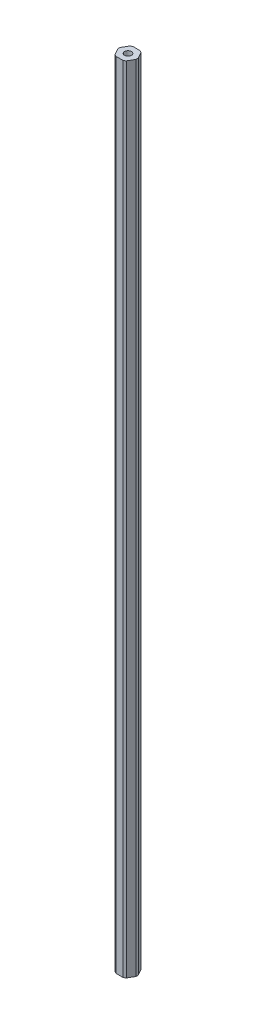
ISO-10303-21;
HEADER;
FILE_DESCRIPTION(('STEP AP214'),'2;1');
FILE_NAME('part.step','',(''),(''),'','','');
FILE_SCHEMA(('AUTOMOTIVE_DESIGN { 1 0 10303 214 1 1 1 1 }'));
ENDSEC;
DATA;
#1=APPLICATION_CONTEXT('core data for automotive mechanical design processes');
#2=APPLICATION_PROTOCOL_DEFINITION('international standard','automotive_design',2000,#1);
#3=PRODUCT_CONTEXT('',#1,'mechanical');
#4=PRODUCT('Part','Part','',(#3));
#5=PRODUCT_RELATED_PRODUCT_CATEGORY('part','',(#4));
#6=PRODUCT_DEFINITION_FORMATION('','',#4);
#7=PRODUCT_DEFINITION_CONTEXT('part definition',#1,'design');
#8=PRODUCT_DEFINITION('design','',#6,#7);
#9=PRODUCT_DEFINITION_SHAPE('','',#8);
#10=(LENGTH_UNIT() NAMED_UNIT(*) SI_UNIT(.MILLI.,.METRE.));
#11=(NAMED_UNIT(*) PLANE_ANGLE_UNIT() SI_UNIT($,.RADIAN.));
#12=(NAMED_UNIT(*) SI_UNIT($,.STERADIAN.) SOLID_ANGLE_UNIT());
#13=UNCERTAINTY_MEASURE_WITH_UNIT(LENGTH_MEASURE(1.E-05),#10,'distance_accuracy_value','');
#14=(GEOMETRIC_REPRESENTATION_CONTEXT(3) GLOBAL_UNCERTAINTY_ASSIGNED_CONTEXT((#13)) GLOBAL_UNIT_ASSIGNED_CONTEXT((#10,
#11,#12)) REPRESENTATION_CONTEXT('',''));
#15=CARTESIAN_POINT('',(0.,0.,0.));
#16=DIRECTION('',(0.,0.,1.));
#17=DIRECTION('',(1.,0.,0.));
#18=AXIS2_PLACEMENT_3D('',#15,#16,#17);
#19=CARTESIAN_POINT('',(-5.49926131403119,-593.725,-3.175));
#20=DIRECTION('',(0.866025403784439,0.,0.5));
#21=DIRECTION('',(0.5,0.,-0.866025403784439));
#22=AXIS2_PLACEMENT_3D('',#19,#20,#21);
#23=PLANE('',#22);
#24=DIRECTION('',(0.5,0.,-0.866025403784439));
#25=VECTOR('',#24,1.);
#26=CARTESIAN_POINT('',(-5.49926131403119,0.,-3.175));
#27=LINE('',#26,#25);
#28=CARTESIAN_POINT('',(-6.81675182633099,0.,-0.893039494206793));
#29=VERTEX_POINT('',#28);
#30=CARTESIAN_POINT('',(-4.18177080173138,0.,-5.45696050579321));
#31=VERTEX_POINT('',#30);
#32=EDGE_CURVE('E155',#29,#31,#27,.T.);
#33=ORIENTED_EDGE('',*,*,#32,.T.);
#34=DIRECTION('',(0.,1.,0.));
#35=VECTOR('',#34,1.);
#36=CARTESIAN_POINT('',(-4.18177080173138,-593.725,-5.45696050579321));
#37=LINE('',#36,#35);
#38=CARTESIAN_POINT('',(-4.18177080173138,-593.725,-5.45696050579321));
#39=VERTEX_POINT('',#38);
#40=EDGE_CURVE('E156',#31,#39,#37,.F.);
#41=ORIENTED_EDGE('',*,*,#40,.T.);
#42=DIRECTION('',(0.5,0.,-0.866025403784439));
#43=VECTOR('',#42,1.);
#44=CARTESIAN_POINT('',(-5.49926131403119,-593.725,-3.175));
#45=LINE('',#44,#43);
#46=CARTESIAN_POINT('',(-6.81675182633099,-593.725,-0.893039494206793));
#47=VERTEX_POINT('',#46);
#48=EDGE_CURVE('E136',#47,#39,#45,.T.);
#49=ORIENTED_EDGE('',*,*,#48,.F.);
#50=DIRECTION('',(0.,1.,0.));
#51=VECTOR('',#50,1.);
#52=CARTESIAN_POINT('',(-6.81675182633099,-593.725,-0.893039494206791));
#53=LINE('',#52,#51);
#54=EDGE_CURVE('E129',#47,#29,#53,.T.);
#55=ORIENTED_EDGE('',*,*,#54,.T.);
#56=EDGE_LOOP('',(#33,#41,#49,#55));
#57=FACE_BOUND('',#56,.T.);
#58=ADVANCED_FACE('F17',(#57),#23,.F.);
#59=CARTESIAN_POINT('',(0.,-593.725,-6.35));
#60=DIRECTION('',(0.,0.,1.));
#61=DIRECTION('',(1.,0.,0.));
#62=AXIS2_PLACEMENT_3D('',#59,#60,#61);
#63=PLANE('',#62);
#64=DIRECTION('',(1.,0.,0.));
#65=VECTOR('',#64,1.);
#66=CARTESIAN_POINT('',(0.,0.,-6.35));
#67=LINE('',#66,#65);
#68=CARTESIAN_POINT('',(-2.63498102459961,0.,-6.35));
#69=VERTEX_POINT('',#68);
#70=CARTESIAN_POINT('',(2.63498102459961,0.,-6.35));
#71=VERTEX_POINT('',#70);
#72=EDGE_CURVE('E128',#69,#71,#67,.T.);
#73=ORIENTED_EDGE('',*,*,#72,.T.);
#74=DIRECTION('',(0.,1.,0.));
#75=VECTOR('',#74,1.);
#76=CARTESIAN_POINT('',(2.63498102459961,-593.725,-6.35));
#77=LINE('',#76,#75);
#78=CARTESIAN_POINT('',(2.63498102459961,-593.725,-6.35));
#79=VERTEX_POINT('',#78);
#80=EDGE_CURVE('E110',#71,#79,#77,.F.);
#81=ORIENTED_EDGE('',*,*,#80,.T.);
#82=DIRECTION('',(1.,0.,0.));
#83=VECTOR('',#82,1.);
#84=CARTESIAN_POINT('',(0.,-593.725,-6.35));
#85=LINE('',#84,#83);
#86=CARTESIAN_POINT('',(-2.63498102459961,-593.725,-6.35));
#87=VERTEX_POINT('',#86);
#88=EDGE_CURVE('E126',#87,#79,#85,.T.);
#89=ORIENTED_EDGE('',*,*,#88,.F.);
#90=DIRECTION('',(0.,1.,0.));
#91=VECTOR('',#90,1.);
#92=CARTESIAN_POINT('',(-2.63498102459961,-593.725,-6.35));
#93=LINE('',#92,#91);
#94=EDGE_CURVE('E130',#87,#69,#93,.T.);
#95=ORIENTED_EDGE('',*,*,#94,.T.);
#96=EDGE_LOOP('',(#73,#81,#89,#95));
#97=FACE_BOUND('',#96,.T.);
#98=ADVANCED_FACE('F125',(#97),#63,.F.);
#99=CARTESIAN_POINT('',(5.49926131403119,-593.725,-3.175));
#100=DIRECTION('',(-0.866025403784439,0.,0.5));
#101=DIRECTION('',(0.5,0.,0.866025403784439));
#102=AXIS2_PLACEMENT_3D('',#99,#100,#101);
#103=PLANE('',#102);
#104=DIRECTION('',(0.5,0.,0.866025403784439));
#105=VECTOR('',#104,1.);
#106=CARTESIAN_POINT('',(5.49926131403119,0.,-3.175));
#107=LINE('',#106,#105);
#108=CARTESIAN_POINT('',(4.18177080173138,0.,-5.45696050579321));
#109=VERTEX_POINT('',#108);
#110=CARTESIAN_POINT('',(6.81675182633099,0.,-0.893039494206797));
#111=VERTEX_POINT('',#110);
#112=EDGE_CURVE('E160',#109,#111,#107,.T.);
#113=ORIENTED_EDGE('',*,*,#112,.T.);
#114=DIRECTION('',(0.,1.,0.));
#115=VECTOR('',#114,1.);
#116=CARTESIAN_POINT('',(6.81675182633099,-593.725,-0.8930394942068));
#117=LINE('',#116,#115);
#118=CARTESIAN_POINT('',(6.81675182633099,-593.725,-0.893039494206797));
#119=VERTEX_POINT('',#118);
#120=EDGE_CURVE('E184',#111,#119,#117,.F.);
#121=ORIENTED_EDGE('',*,*,#120,.T.);
#122=DIRECTION('',(0.5,0.,0.866025403784439));
#123=VECTOR('',#122,1.);
#124=CARTESIAN_POINT('',(5.49926131403119,-593.725,-3.175));
#125=LINE('',#124,#123);
#126=CARTESIAN_POINT('',(4.18177080173138,-593.725,-5.45696050579321));
#127=VERTEX_POINT('',#126);
#128=EDGE_CURVE('E135',#127,#119,#125,.T.);
#129=ORIENTED_EDGE('',*,*,#128,.F.);
#130=DIRECTION('',(0.,1.,0.));
#131=VECTOR('',#130,1.);
#132=CARTESIAN_POINT('',(4.18177080173139,-593.725,-5.4569605057932));
#133=LINE('',#132,#131);
#134=EDGE_CURVE('E113',#127,#109,#133,.T.);
#135=ORIENTED_EDGE('',*,*,#134,.T.);
#136=EDGE_LOOP('',(#113,#121,#129,#135));
#137=FACE_BOUND('',#136,.T.);
#138=ADVANCED_FACE('F231',(#137),#103,.F.);
#139=CARTESIAN_POINT('',(5.49926131403119,-593.725,3.175));
#140=DIRECTION('',(-0.866025403784439,0.,-0.5));
#141=DIRECTION('',(-0.5,0.,0.866025403784439));
#142=AXIS2_PLACEMENT_3D('',#139,#140,#141);
#143=PLANE('',#142);
#144=DIRECTION('',(-0.5,0.,0.866025403784439));
#145=VECTOR('',#144,1.);
#146=CARTESIAN_POINT('',(5.49926131403119,0.,3.175));
#147=LINE('',#146,#145);
#148=CARTESIAN_POINT('',(6.81675182633099,0.,0.893039494206778));
#149=VERTEX_POINT('',#148);
#150=CARTESIAN_POINT('',(4.18177080173137,0.,5.45696050579322));
#151=VERTEX_POINT('',#150);
#152=EDGE_CURVE('E163',#149,#151,#147,.T.);
#153=ORIENTED_EDGE('',*,*,#152,.T.);
#154=DIRECTION('',(0.,1.,0.));
#155=VECTOR('',#154,1.);
#156=CARTESIAN_POINT('',(4.18177080173137,-593.725,5.45696050579322));
#157=LINE('',#156,#155);
#158=CARTESIAN_POINT('',(4.18177080173137,-593.725,5.45696050579322));
#159=VERTEX_POINT('',#158);
#160=EDGE_CURVE('E188',#151,#159,#157,.F.);
#161=ORIENTED_EDGE('',*,*,#160,.T.);
#162=DIRECTION('',(-0.5,0.,0.866025403784439));
#163=VECTOR('',#162,1.);
#164=CARTESIAN_POINT('',(5.49926131403119,-593.725,3.175));
#165=LINE('',#164,#163);
#166=CARTESIAN_POINT('',(6.81675182633099,-593.725,0.893039494206778));
#167=VERTEX_POINT('',#166);
#168=EDGE_CURVE('E138',#167,#159,#165,.T.);
#169=ORIENTED_EDGE('',*,*,#168,.F.);
#170=DIRECTION('',(0.,1.,0.));
#171=VECTOR('',#170,1.);
#172=CARTESIAN_POINT('',(6.81675182633099,-593.725,0.893039494206777));
#173=LINE('',#172,#171);
#174=EDGE_CURVE('E191',#167,#149,#173,.T.);
#175=ORIENTED_EDGE('',*,*,#174,.T.);
#176=EDGE_LOOP('',(#153,#161,#169,#175));
#177=FACE_BOUND('',#176,.T.);
#178=ADVANCED_FACE('F227',(#177),#143,.F.);
#179=CARTESIAN_POINT('',(0.,-593.725,6.35));
#180=DIRECTION('',(0.,0.,-1.));
#181=DIRECTION('',(-1.,0.,0.));
#182=AXIS2_PLACEMENT_3D('',#179,#180,#181);
#183=PLANE('',#182);
#184=DIRECTION('',(-1.,0.,0.));
#185=VECTOR('',#184,1.);
#186=CARTESIAN_POINT('',(0.,0.,6.35));
#187=LINE('',#186,#185);
#188=CARTESIAN_POINT('',(2.63498102459961,0.,6.35));
#189=VERTEX_POINT('',#188);
#190=CARTESIAN_POINT('',(-2.63498102459961,0.,6.35));
#191=VERTEX_POINT('',#190);
#192=EDGE_CURVE('E165',#189,#191,#187,.T.);
#193=ORIENTED_EDGE('',*,*,#192,.T.);
#194=DIRECTION('',(0.,1.,0.));
#195=VECTOR('',#194,1.);
#196=CARTESIAN_POINT('',(-2.63498102459961,-593.725,6.35));
#197=LINE('',#196,#195);
#198=CARTESIAN_POINT('',(-2.63498102459961,-593.725,6.35));
#199=VERTEX_POINT('',#198);
#200=EDGE_CURVE('E194',#191,#199,#197,.F.);
#201=ORIENTED_EDGE('',*,*,#200,.T.);
#202=DIRECTION('',(-1.,0.,0.));
#203=VECTOR('',#202,1.);
#204=CARTESIAN_POINT('',(0.,-593.725,6.35));
#205=LINE('',#204,#203);
#206=CARTESIAN_POINT('',(2.63498102459961,-593.725,6.35));
#207=VERTEX_POINT('',#206);
#208=EDGE_CURVE('E146',#207,#199,#205,.T.);
#209=ORIENTED_EDGE('',*,*,#208,.F.);
#210=DIRECTION('',(0.,1.,0.));
#211=VECTOR('',#210,1.);
#212=CARTESIAN_POINT('',(2.63498102459961,-593.725,6.35));
#213=LINE('',#212,#211);
#214=EDGE_CURVE('E196',#207,#189,#213,.T.);
#215=ORIENTED_EDGE('',*,*,#214,.T.);
#216=EDGE_LOOP('',(#193,#201,#209,#215));
#217=FACE_BOUND('',#216,.T.);
#218=ADVANCED_FACE('F212',(#217),#183,.F.);
#219=CARTESIAN_POINT('',(0.,-593.725,0.));
#220=DIRECTION('',(0.,1.,0.));
#221=DIRECTION('',(0.,0.,1.));
#222=AXIS2_PLACEMENT_3D('',#219,#220,#221);
#223=CYLINDRICAL_SURFACE('',#222,2.5499949);
#224=CARTESIAN_POINT('',(0.,-593.725,0.));
#225=DIRECTION('',(0.,-1.,0.));
#226=DIRECTION('',(0.,0.,-1.));
#227=AXIS2_PLACEMENT_3D('',#224,#225,#226);
#228=CIRCLE('',#227,2.5499949);
#229=CARTESIAN_POINT('',(0.,-593.725,-2.5499949));
#230=VERTEX_POINT('',#229);
#231=EDGE_CURVE('E140',#230,#230,#228,.T.);
#232=ORIENTED_EDGE('',*,*,#231,.T.);
#233=EDGE_LOOP('',(#232));
#234=FACE_BOUND('',#233,.T.);
#235=CARTESIAN_POINT('',(0.,0.,0.));
#236=DIRECTION('',(0.,-1.,0.));
#237=DIRECTION('',(0.,0.,-1.));
#238=AXIS2_PLACEMENT_3D('',#235,#236,#237);
#239=CIRCLE('',#238,2.5499949);
#240=CARTESIAN_POINT('',(0.,0.,-2.5499949));
#241=VERTEX_POINT('',#240);
#242=EDGE_CURVE('E152',#241,#241,#239,.T.);
#243=ORIENTED_EDGE('',*,*,#242,.F.);
#244=EDGE_LOOP('',(#243));
#245=FACE_BOUND('',#244,.T.);
#246=ADVANCED_FACE('F19',(#234,#245),#223,.F.);
#247=CARTESIAN_POINT('',(-5.49926131403119,-593.725,3.175));
#248=DIRECTION('',(0.866025403784438,0.,-0.5));
#249=DIRECTION('',(-0.5,0.,-0.866025403784438));
#250=AXIS2_PLACEMENT_3D('',#247,#248,#249);
#251=PLANE('',#250);
#252=DIRECTION('',(-0.5,0.,-0.866025403784439));
#253=VECTOR('',#252,1.);
#254=CARTESIAN_POINT('',(-5.49926131403119,0.,3.175));
#255=LINE('',#254,#253);
#256=CARTESIAN_POINT('',(-4.18177080173138,0.,5.45696050579321));
#257=VERTEX_POINT('',#256);
#258=CARTESIAN_POINT('',(-6.81675182633099,0.,0.8930394942068));
#259=VERTEX_POINT('',#258);
#260=EDGE_CURVE('E21',#257,#259,#255,.T.);
#261=ORIENTED_EDGE('',*,*,#260,.T.);
#262=DIRECTION('',(0.,1.,0.));
#263=VECTOR('',#262,1.);
#264=CARTESIAN_POINT('',(-6.81675182633099,-593.725,0.893039494206801));
#265=LINE('',#264,#263);
#266=CARTESIAN_POINT('',(-6.81675182633099,-593.725,0.893039494206801));
#267=VERTEX_POINT('',#266);
#268=EDGE_CURVE('E198',#259,#267,#265,.F.);
#269=ORIENTED_EDGE('',*,*,#268,.T.);
#270=DIRECTION('',(-0.5,0.,-0.866025403784439));
#271=VECTOR('',#270,1.);
#272=CARTESIAN_POINT('',(-5.49926131403119,-593.725,3.175));
#273=LINE('',#272,#271);
#274=CARTESIAN_POINT('',(-4.18177080173138,-593.725,5.45696050579321));
#275=VERTEX_POINT('',#274);
#276=EDGE_CURVE('E149',#275,#267,#273,.T.);
#277=ORIENTED_EDGE('',*,*,#276,.F.);
#278=DIRECTION('',(0.,1.,0.));
#279=VECTOR('',#278,1.);
#280=CARTESIAN_POINT('',(-4.18177080173138,-593.725,5.45696050579321));
#281=LINE('',#280,#279);
#282=EDGE_CURVE('E118',#275,#257,#281,.T.);
#283=ORIENTED_EDGE('',*,*,#282,.T.);
#284=EDGE_LOOP('',(#261,#269,#277,#283));
#285=FACE_BOUND('',#284,.T.);
#286=ADVANCED_FACE('F255',(#285),#251,.F.);
#287=CARTESIAN_POINT('',(0.,-593.725,0.));
#288=DIRECTION('',(0.,-1.,0.));
#289=DIRECTION('',(1.,0.,0.));
#290=AXIS2_PLACEMENT_3D('',#287,#288,#289);
#291=PLANE('',#290);
#292=ORIENTED_EDGE('',*,*,#231,.F.);
#293=EDGE_LOOP('',(#292));
#294=FACE_BOUND('',#293,.T.);
#295=ORIENTED_EDGE('',*,*,#88,.T.);
#296=CARTESIAN_POINT('',(0.,-593.725,0.));
#297=DIRECTION('',(0.,-1.,0.));
#298=DIRECTION('',(0.,0.,-1.));
#299=AXIS2_PLACEMENT_3D('',#296,#297,#298);
#300=CIRCLE('',#299,6.875);
#301=EDGE_CURVE('E107',#79,#127,#300,.T.);
#302=ORIENTED_EDGE('',*,*,#301,.T.);
#303=ORIENTED_EDGE('',*,*,#128,.T.);
#304=EDGE_CURVE('E119',#119,#167,#300,.T.);
#305=ORIENTED_EDGE('',*,*,#304,.T.);
#306=ORIENTED_EDGE('',*,*,#168,.T.);
#307=EDGE_CURVE('E222',#159,#207,#300,.T.);
#308=ORIENTED_EDGE('',*,*,#307,.T.);
#309=ORIENTED_EDGE('',*,*,#208,.T.);
#310=EDGE_CURVE('E221',#199,#275,#300,.T.);
#311=ORIENTED_EDGE('',*,*,#310,.T.);
#312=ORIENTED_EDGE('',*,*,#276,.T.);
#313=EDGE_CURVE('E35',#267,#47,#300,.T.);
#314=ORIENTED_EDGE('',*,*,#313,.T.);
#315=ORIENTED_EDGE('',*,*,#48,.T.);
#316=EDGE_CURVE('E121',#39,#87,#300,.T.);
#317=ORIENTED_EDGE('',*,*,#316,.T.);
#318=EDGE_LOOP('',(#295,#302,#303,#305,#306,#308,#309,#311,#312,#314,#315,#317));
#319=FACE_BOUND('',#318,.T.);
#320=ADVANCED_FACE('F133',(#294,#319),#291,.T.);
#321=CARTESIAN_POINT('',(0.,0.,0.));
#322=DIRECTION('',(0.,-1.,0.));
#323=DIRECTION('',(1.,0.,0.));
#324=AXIS2_PLACEMENT_3D('',#321,#322,#323);
#325=PLANE('',#324);
#326=CARTESIAN_POINT('',(0.,0.,0.));
#327=DIRECTION('',(0.,-1.,0.));
#328=DIRECTION('',(0.,0.,-1.));
#329=AXIS2_PLACEMENT_3D('',#326,#327,#328);
#330=CIRCLE('',#329,6.875);
#331=EDGE_CURVE('E28',#71,#109,#330,.T.);
#332=ORIENTED_EDGE('',*,*,#331,.F.);
#333=ORIENTED_EDGE('',*,*,#72,.F.);
#334=EDGE_CURVE('E43',#31,#69,#330,.T.);
#335=ORIENTED_EDGE('',*,*,#334,.F.);
#336=ORIENTED_EDGE('',*,*,#32,.F.);
#337=EDGE_CURVE('E200',#259,#29,#330,.T.);
#338=ORIENTED_EDGE('',*,*,#337,.F.);
#339=ORIENTED_EDGE('',*,*,#260,.F.);
#340=EDGE_CURVE('E201',#191,#257,#330,.T.);
#341=ORIENTED_EDGE('',*,*,#340,.F.);
#342=ORIENTED_EDGE('',*,*,#192,.F.);
#343=EDGE_CURVE('E26',#151,#189,#330,.T.);
#344=ORIENTED_EDGE('',*,*,#343,.F.);
#345=ORIENTED_EDGE('',*,*,#152,.F.);
#346=EDGE_CURVE('E11',#111,#149,#330,.T.);
#347=ORIENTED_EDGE('',*,*,#346,.F.);
#348=ORIENTED_EDGE('',*,*,#112,.F.);
#349=EDGE_LOOP('',(#332,#333,#335,#336,#338,#339,#341,#342,#344,#345,#347,#348));
#350=FACE_BOUND('',#349,.T.);
#351=ORIENTED_EDGE('',*,*,#242,.T.);
#352=EDGE_LOOP('',(#351));
#353=FACE_BOUND('',#352,.T.);
#354=ADVANCED_FACE('F213',(#350,#353),#325,.F.);
#355=CARTESIAN_POINT('',(0.,-593.725,0.));
#356=DIRECTION('',(0.,1.,0.));
#357=DIRECTION('',(0.,0.,1.));
#358=AXIS2_PLACEMENT_3D('',#355,#356,#357);
#359=CYLINDRICAL_SURFACE('',#358,6.875);
#360=ORIENTED_EDGE('',*,*,#340,.T.);
#361=ORIENTED_EDGE('',*,*,#282,.F.);
#362=ORIENTED_EDGE('',*,*,#310,.F.);
#363=ORIENTED_EDGE('',*,*,#200,.F.);
#364=EDGE_LOOP('',(#360,#361,#362,#363));
#365=FACE_BOUND('',#364,.T.);
#366=ADVANCED_FACE('F241',(#365),#359,.T.);
#367=ORIENTED_EDGE('',*,*,#313,.F.);
#368=ORIENTED_EDGE('',*,*,#268,.F.);
#369=ORIENTED_EDGE('',*,*,#337,.T.);
#370=ORIENTED_EDGE('',*,*,#54,.F.);
#371=EDGE_LOOP('',(#367,#368,#369,#370));
#372=FACE_BOUND('',#371,.T.);
#373=ADVANCED_FACE('F218',(#372),#359,.T.);
#374=ORIENTED_EDGE('',*,*,#343,.T.);
#375=ORIENTED_EDGE('',*,*,#214,.F.);
#376=ORIENTED_EDGE('',*,*,#307,.F.);
#377=ORIENTED_EDGE('',*,*,#160,.F.);
#378=EDGE_LOOP('',(#374,#375,#376,#377));
#379=FACE_BOUND('',#378,.T.);
#380=ADVANCED_FACE('F207',(#379),#359,.T.);
#381=ORIENTED_EDGE('',*,*,#346,.T.);
#382=ORIENTED_EDGE('',*,*,#174,.F.);
#383=ORIENTED_EDGE('',*,*,#304,.F.);
#384=ORIENTED_EDGE('',*,*,#120,.F.);
#385=EDGE_LOOP('',(#381,#382,#383,#384));
#386=FACE_BOUND('',#385,.T.);
#387=ADVANCED_FACE('F232',(#386),#359,.T.);
#388=ORIENTED_EDGE('',*,*,#331,.T.);
#389=ORIENTED_EDGE('',*,*,#134,.F.);
#390=ORIENTED_EDGE('',*,*,#301,.F.);
#391=ORIENTED_EDGE('',*,*,#80,.F.);
#392=EDGE_LOOP('',(#388,#389,#390,#391));
#393=FACE_BOUND('',#392,.T.);
#394=ADVANCED_FACE('F109',(#393),#359,.T.);
#395=ORIENTED_EDGE('',*,*,#334,.T.);
#396=ORIENTED_EDGE('',*,*,#94,.F.);
#397=ORIENTED_EDGE('',*,*,#316,.F.);
#398=ORIENTED_EDGE('',*,*,#40,.F.);
#399=EDGE_LOOP('',(#395,#396,#397,#398));
#400=FACE_BOUND('',#399,.T.);
#401=ADVANCED_FACE('F240',(#400),#359,.T.);
#402=CLOSED_SHELL('',(#58,#98,#138,#178,#218,#246,#286,#320,#354,#366,#373,#380,#387,#394,#401));
#403=MANIFOLD_SOLID_BREP('B1',#402);
#404=ADVANCED_BREP_SHAPE_REPRESENTATION('',(#18,#403),#14);
#405=SHAPE_DEFINITION_REPRESENTATION(#9,#404);
ENDSEC;
END-ISO-10303-21;
